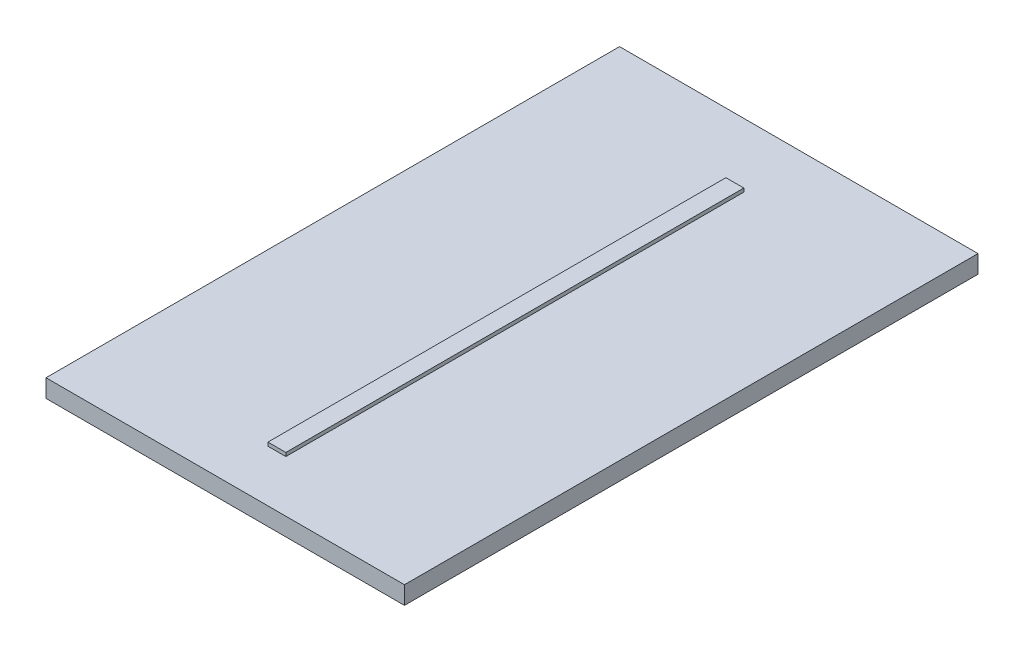
ISO-10303-21;
HEADER;
FILE_DESCRIPTION(('STEP AP214'),'2;1');
FILE_NAME('part.step','',(''),(''),'','','');
FILE_SCHEMA(('AUTOMOTIVE_DESIGN { 1 0 10303 214 1 1 1 1 }'));
ENDSEC;
DATA;
#1=APPLICATION_CONTEXT('core data for automotive mechanical design processes');
#2=APPLICATION_PROTOCOL_DEFINITION('international standard','automotive_design',2000,#1);
#3=PRODUCT_CONTEXT('',#1,'mechanical');
#4=PRODUCT('Part','Part','',(#3));
#5=PRODUCT_RELATED_PRODUCT_CATEGORY('part','',(#4));
#6=PRODUCT_DEFINITION_FORMATION('','',#4);
#7=PRODUCT_DEFINITION_CONTEXT('part definition',#1,'design');
#8=PRODUCT_DEFINITION('design','',#6,#7);
#9=PRODUCT_DEFINITION_SHAPE('','',#8);
#10=(LENGTH_UNIT() NAMED_UNIT(*) SI_UNIT(.MILLI.,.METRE.));
#11=(NAMED_UNIT(*) PLANE_ANGLE_UNIT() SI_UNIT($,.RADIAN.));
#12=(NAMED_UNIT(*) SI_UNIT($,.STERADIAN.) SOLID_ANGLE_UNIT());
#13=UNCERTAINTY_MEASURE_WITH_UNIT(LENGTH_MEASURE(1.E-05),#10,'distance_accuracy_value','');
#14=(GEOMETRIC_REPRESENTATION_CONTEXT(3) GLOBAL_UNCERTAINTY_ASSIGNED_CONTEXT((#13)) GLOBAL_UNIT_ASSIGNED_CONTEXT((#10,
#11,#12)) REPRESENTATION_CONTEXT('',''));
#15=CARTESIAN_POINT('',(0.,0.,0.));
#16=DIRECTION('',(0.,0.,1.));
#17=DIRECTION('',(1.,0.,0.));
#18=AXIS2_PLACEMENT_3D('',#15,#16,#17);
#19=CARTESIAN_POINT('',(0.,0.5,0.));
#20=DIRECTION('',(0.,1.,0.));
#21=DIRECTION('',(0.,0.,1.));
#22=AXIS2_PLACEMENT_3D('',#19,#20,#21);
#23=PLANE('',#22);
#24=DIRECTION('',(0.,0.,-1.));
#25=VECTOR('',#24,1.);
#26=CARTESIAN_POINT('',(5.,0.5,-8.));
#27=LINE('',#26,#25);
#28=CARTESIAN_POINT('',(5.,0.5,8.));
#29=VERTEX_POINT('',#28);
#30=CARTESIAN_POINT('',(5.,0.5,-8.));
#31=VERTEX_POINT('',#30);
#32=EDGE_CURVE('E142',#29,#31,#27,.T.);
#33=ORIENTED_EDGE('',*,*,#32,.T.);
#34=DIRECTION('',(-1.,0.,0.));
#35=VECTOR('',#34,1.);
#36=CARTESIAN_POINT('',(-5.,0.5,-8.));
#37=LINE('',#36,#35);
#38=CARTESIAN_POINT('',(-5.,0.5,-8.));
#39=VERTEX_POINT('',#38);
#40=EDGE_CURVE('E87',#31,#39,#37,.T.);
#41=ORIENTED_EDGE('',*,*,#40,.T.);
#42=DIRECTION('',(0.,0.,1.));
#43=VECTOR('',#42,1.);
#44=CARTESIAN_POINT('',(-5.,0.5,-8.));
#45=LINE('',#44,#43);
#46=CARTESIAN_POINT('',(-5.,0.5,8.));
#47=VERTEX_POINT('',#46);
#48=EDGE_CURVE('E145',#39,#47,#45,.T.);
#49=ORIENTED_EDGE('',*,*,#48,.T.);
#50=DIRECTION('',(1.,0.,0.));
#51=VECTOR('',#50,1.);
#52=CARTESIAN_POINT('',(-5.,0.5,8.));
#53=LINE('',#52,#51);
#54=EDGE_CURVE('E59',#47,#29,#53,.T.);
#55=ORIENTED_EDGE('',*,*,#54,.T.);
#56=EDGE_LOOP('',(#33,#41,#49,#55));
#57=FACE_BOUND('',#56,.T.);
#58=DIRECTION('',(-1.,0.,0.));
#59=VECTOR('',#58,1.);
#60=CARTESIAN_POINT('',(-0.250000000000001,0.5,-6.21728312292191));
#61=LINE('',#60,#59);
#62=CARTESIAN_POINT('',(0.249999999999999,0.5,-6.21728312292191));
#63=VERTEX_POINT('',#62);
#64=CARTESIAN_POINT('',(-0.250000000000001,0.5,-6.21728312292191));
#65=VERTEX_POINT('',#64);
#66=EDGE_CURVE('E265',#63,#65,#61,.T.);
#67=ORIENTED_EDGE('',*,*,#66,.F.);
#68=DIRECTION('',(0.,0.,-1.));
#69=VECTOR('',#68,1.);
#70=CARTESIAN_POINT('',(0.249999999999999,0.5,-6.21728312292191));
#71=LINE('',#70,#69);
#72=CARTESIAN_POINT('',(0.250000000000001,0.5,6.55913442902545));
#73=VERTEX_POINT('',#72);
#74=EDGE_CURVE('E132',#73,#63,#71,.T.);
#75=ORIENTED_EDGE('',*,*,#74,.F.);
#76=DIRECTION('',(1.,0.,0.));
#77=VECTOR('',#76,1.);
#78=CARTESIAN_POINT('',(-0.249999999999999,0.5,6.55913442902545));
#79=LINE('',#78,#77);
#80=CARTESIAN_POINT('',(-0.249999999999999,0.5,6.55913442902545));
#81=VERTEX_POINT('',#80);
#82=EDGE_CURVE('E128',#81,#73,#79,.T.);
#83=ORIENTED_EDGE('',*,*,#82,.F.);
#84=DIRECTION('',(0.,0.,1.));
#85=VECTOR('',#84,1.);
#86=CARTESIAN_POINT('',(-0.250000000000001,0.5,-6.21728312292191));
#87=LINE('',#86,#85);
#88=EDGE_CURVE('E262',#65,#81,#87,.T.);
#89=ORIENTED_EDGE('',*,*,#88,.F.);
#90=EDGE_LOOP('',(#67,#75,#83,#89));
#91=FACE_BOUND('',#90,.T.);
#92=ADVANCED_FACE('F35',(#57,#91),#23,.T.);
#93=CARTESIAN_POINT('',(5.,0.5,-8.));
#94=DIRECTION('',(-1.,0.,0.));
#95=DIRECTION('',(0.,0.,1.));
#96=AXIS2_PLACEMENT_3D('',#93,#94,#95);
#97=PLANE('',#96);
#98=DIRECTION('',(0.,0.,-1.));
#99=VECTOR('',#98,1.);
#100=CARTESIAN_POINT('',(5.,0.,-8.));
#101=LINE('',#100,#99);
#102=CARTESIAN_POINT('',(5.,0.,8.));
#103=VERTEX_POINT('',#102);
#104=CARTESIAN_POINT('',(5.,0.,-8.));
#105=VERTEX_POINT('',#104);
#106=EDGE_CURVE('E134',#103,#105,#101,.T.);
#107=ORIENTED_EDGE('',*,*,#106,.T.);
#108=DIRECTION('',(0.,-1.,0.));
#109=VECTOR('',#108,1.);
#110=CARTESIAN_POINT('',(5.,0.5,-8.));
#111=LINE('',#110,#109);
#112=EDGE_CURVE('E11',#31,#105,#111,.T.);
#113=ORIENTED_EDGE('',*,*,#112,.F.);
#114=ORIENTED_EDGE('',*,*,#32,.F.);
#115=DIRECTION('',(0.,-1.,0.));
#116=VECTOR('',#115,1.);
#117=CARTESIAN_POINT('',(5.,0.5,8.));
#118=LINE('',#117,#116);
#119=EDGE_CURVE('E147',#29,#103,#118,.T.);
#120=ORIENTED_EDGE('',*,*,#119,.T.);
#121=EDGE_LOOP('',(#107,#113,#114,#120));
#122=FACE_BOUND('',#121,.T.);
#123=ADVANCED_FACE('F37',(#122),#97,.F.);
#124=CARTESIAN_POINT('',(-5.,0.5,-8.));
#125=DIRECTION('',(0.,0.,1.));
#126=DIRECTION('',(1.,0.,0.));
#127=AXIS2_PLACEMENT_3D('',#124,#125,#126);
#128=PLANE('',#127);
#129=DIRECTION('',(-1.,0.,0.));
#130=VECTOR('',#129,1.);
#131=CARTESIAN_POINT('',(-5.,0.,-8.));
#132=LINE('',#131,#130);
#133=CARTESIAN_POINT('',(-5.,0.,-8.));
#134=VERTEX_POINT('',#133);
#135=EDGE_CURVE('E137',#105,#134,#132,.T.);
#136=ORIENTED_EDGE('',*,*,#135,.T.);
#137=DIRECTION('',(0.,-1.,0.));
#138=VECTOR('',#137,1.);
#139=CARTESIAN_POINT('',(-5.,0.5,-8.));
#140=LINE('',#139,#138);
#141=EDGE_CURVE('E43',#39,#134,#140,.T.);
#142=ORIENTED_EDGE('',*,*,#141,.F.);
#143=ORIENTED_EDGE('',*,*,#40,.F.);
#144=ORIENTED_EDGE('',*,*,#112,.T.);
#145=EDGE_LOOP('',(#136,#142,#143,#144));
#146=FACE_BOUND('',#145,.T.);
#147=ADVANCED_FACE('F175',(#146),#128,.F.);
#148=CARTESIAN_POINT('',(-5.,0.5,-8.));
#149=DIRECTION('',(1.,0.,0.));
#150=DIRECTION('',(0.,0.,-1.));
#151=AXIS2_PLACEMENT_3D('',#148,#149,#150);
#152=PLANE('',#151);
#153=DIRECTION('',(0.,0.,1.));
#154=VECTOR('',#153,1.);
#155=CARTESIAN_POINT('',(-5.,0.,-8.));
#156=LINE('',#155,#154);
#157=CARTESIAN_POINT('',(-5.,0.,8.));
#158=VERTEX_POINT('',#157);
#159=EDGE_CURVE('E150',#134,#158,#156,.T.);
#160=ORIENTED_EDGE('',*,*,#159,.T.);
#161=DIRECTION('',(0.,-1.,0.));
#162=VECTOR('',#161,1.);
#163=CARTESIAN_POINT('',(-5.,0.5,8.));
#164=LINE('',#163,#162);
#165=EDGE_CURVE('E154',#47,#158,#164,.T.);
#166=ORIENTED_EDGE('',*,*,#165,.F.);
#167=ORIENTED_EDGE('',*,*,#48,.F.);
#168=ORIENTED_EDGE('',*,*,#141,.T.);
#169=EDGE_LOOP('',(#160,#166,#167,#168));
#170=FACE_BOUND('',#169,.T.);
#171=ADVANCED_FACE('F159',(#170),#152,.F.);
#172=CARTESIAN_POINT('',(-5.,0.5,8.));
#173=DIRECTION('',(0.,0.,-1.));
#174=DIRECTION('',(-1.,0.,0.));
#175=AXIS2_PLACEMENT_3D('',#172,#173,#174);
#176=PLANE('',#175);
#177=DIRECTION('',(1.,0.,0.));
#178=VECTOR('',#177,1.);
#179=CARTESIAN_POINT('',(-5.,0.,8.));
#180=LINE('',#179,#178);
#181=EDGE_CURVE('E80',#158,#103,#180,.T.);
#182=ORIENTED_EDGE('',*,*,#181,.T.);
#183=ORIENTED_EDGE('',*,*,#119,.F.);
#184=ORIENTED_EDGE('',*,*,#54,.F.);
#185=ORIENTED_EDGE('',*,*,#165,.T.);
#186=EDGE_LOOP('',(#182,#183,#184,#185));
#187=FACE_BOUND('',#186,.T.);
#188=ADVANCED_FACE('F167',(#187),#176,.F.);
#189=CARTESIAN_POINT('',(0.,0.,0.));
#190=DIRECTION('',(0.,1.,0.));
#191=DIRECTION('',(0.,0.,1.));
#192=AXIS2_PLACEMENT_3D('',#189,#190,#191);
#193=PLANE('',#192);
#194=ORIENTED_EDGE('',*,*,#106,.F.);
#195=ORIENTED_EDGE('',*,*,#181,.F.);
#196=ORIENTED_EDGE('',*,*,#159,.F.);
#197=ORIENTED_EDGE('',*,*,#135,.F.);
#198=EDGE_LOOP('',(#194,#195,#196,#197));
#199=FACE_BOUND('',#198,.T.);
#200=ADVANCED_FACE('F163',(#199),#193,.F.);
#201=CARTESIAN_POINT('',(0.249999999999999,0.6,-6.21728312292191));
#202=DIRECTION('',(-1.,0.,0.));
#203=DIRECTION('',(0.,0.,1.));
#204=AXIS2_PLACEMENT_3D('',#201,#202,#203);
#205=PLANE('',#204);
#206=ORIENTED_EDGE('',*,*,#74,.T.);
#207=DIRECTION('',(0.,-1.,0.));
#208=VECTOR('',#207,1.);
#209=CARTESIAN_POINT('',(0.249999999999999,0.6,-6.21728312292191));
#210=LINE('',#209,#208);
#211=CARTESIAN_POINT('',(0.249999999999999,0.6,-6.21728312292191));
#212=VERTEX_POINT('',#211);
#213=EDGE_CURVE('E113',#212,#63,#210,.T.);
#214=ORIENTED_EDGE('',*,*,#213,.F.);
#215=DIRECTION('',(0.,0.,-1.));
#216=VECTOR('',#215,1.);
#217=CARTESIAN_POINT('',(0.249999999999999,0.6,-6.21728312292191));
#218=LINE('',#217,#216);
#219=CARTESIAN_POINT('',(0.250000000000001,0.6,6.55913442902545));
#220=VERTEX_POINT('',#219);
#221=EDGE_CURVE('E120',#220,#212,#218,.T.);
#222=ORIENTED_EDGE('',*,*,#221,.F.);
#223=DIRECTION('',(0.,-1.,0.));
#224=VECTOR('',#223,1.);
#225=CARTESIAN_POINT('',(0.250000000000001,0.6,6.55913442902545));
#226=LINE('',#225,#224);
#227=EDGE_CURVE('E260',#220,#73,#226,.T.);
#228=ORIENTED_EDGE('',*,*,#227,.T.);
#229=EDGE_LOOP('',(#206,#214,#222,#228));
#230=FACE_BOUND('',#229,.T.);
#231=ADVANCED_FACE('F130',(#230),#205,.F.);
#232=CARTESIAN_POINT('',(-0.250000000000001,0.6,-6.21728312292191));
#233=DIRECTION('',(0.,0.,1.));
#234=DIRECTION('',(1.,0.,0.));
#235=AXIS2_PLACEMENT_3D('',#232,#233,#234);
#236=PLANE('',#235);
#237=ORIENTED_EDGE('',*,*,#66,.T.);
#238=DIRECTION('',(0.,-1.,0.));
#239=VECTOR('',#238,1.);
#240=CARTESIAN_POINT('',(-0.250000000000001,0.6,-6.21728312292191));
#241=LINE('',#240,#239);
#242=CARTESIAN_POINT('',(-0.250000000000001,0.6,-6.21728312292191));
#243=VERTEX_POINT('',#242);
#244=EDGE_CURVE('E116',#243,#65,#241,.T.);
#245=ORIENTED_EDGE('',*,*,#244,.F.);
#246=DIRECTION('',(-1.,0.,0.));
#247=VECTOR('',#246,1.);
#248=CARTESIAN_POINT('',(-0.250000000000001,0.6,-6.21728312292191));
#249=LINE('',#248,#247);
#250=EDGE_CURVE('E109',#212,#243,#249,.T.);
#251=ORIENTED_EDGE('',*,*,#250,.F.);
#252=ORIENTED_EDGE('',*,*,#213,.T.);
#253=EDGE_LOOP('',(#237,#245,#251,#252));
#254=FACE_BOUND('',#253,.T.);
#255=ADVANCED_FACE('F111',(#254),#236,.F.);
#256=CARTESIAN_POINT('',(-0.250000000000001,0.6,-6.21728312292191));
#257=DIRECTION('',(1.,0.,0.));
#258=DIRECTION('',(0.,0.,-1.));
#259=AXIS2_PLACEMENT_3D('',#256,#257,#258);
#260=PLANE('',#259);
#261=ORIENTED_EDGE('',*,*,#88,.T.);
#262=DIRECTION('',(0.,-1.,0.));
#263=VECTOR('',#262,1.);
#264=CARTESIAN_POINT('',(-0.249999999999999,0.6,6.55913442902545));
#265=LINE('',#264,#263);
#266=CARTESIAN_POINT('',(-0.249999999999999,0.6,6.55913442902545));
#267=VERTEX_POINT('',#266);
#268=EDGE_CURVE('E50',#267,#81,#265,.T.);
#269=ORIENTED_EDGE('',*,*,#268,.F.);
#270=DIRECTION('',(0.,0.,1.));
#271=VECTOR('',#270,1.);
#272=CARTESIAN_POINT('',(-0.250000000000001,0.6,-6.21728312292191));
#273=LINE('',#272,#271);
#274=EDGE_CURVE('E119',#243,#267,#273,.T.);
#275=ORIENTED_EDGE('',*,*,#274,.F.);
#276=ORIENTED_EDGE('',*,*,#244,.T.);
#277=EDGE_LOOP('',(#261,#269,#275,#276));
#278=FACE_BOUND('',#277,.T.);
#279=ADVANCED_FACE('F188',(#278),#260,.F.);
#280=CARTESIAN_POINT('',(-0.249999999999999,0.6,6.55913442902545));
#281=DIRECTION('',(0.,0.,-1.));
#282=DIRECTION('',(-1.,0.,0.));
#283=AXIS2_PLACEMENT_3D('',#280,#281,#282);
#284=PLANE('',#283);
#285=ORIENTED_EDGE('',*,*,#82,.T.);
#286=ORIENTED_EDGE('',*,*,#227,.F.);
#287=DIRECTION('',(1.,0.,0.));
#288=VECTOR('',#287,1.);
#289=CARTESIAN_POINT('',(-0.249999999999999,0.6,6.55913442902545));
#290=LINE('',#289,#288);
#291=EDGE_CURVE('E124',#267,#220,#290,.T.);
#292=ORIENTED_EDGE('',*,*,#291,.F.);
#293=ORIENTED_EDGE('',*,*,#268,.T.);
#294=EDGE_LOOP('',(#285,#286,#292,#293));
#295=FACE_BOUND('',#294,.T.);
#296=ADVANCED_FACE('F191',(#295),#284,.F.);
#297=CARTESIAN_POINT('',(0.,0.6,0.));
#298=DIRECTION('',(0.,1.,0.));
#299=DIRECTION('',(0.,0.,1.));
#300=AXIS2_PLACEMENT_3D('',#297,#298,#299);
#301=PLANE('',#300);
#302=ORIENTED_EDGE('',*,*,#221,.T.);
#303=ORIENTED_EDGE('',*,*,#250,.T.);
#304=ORIENTED_EDGE('',*,*,#274,.T.);
#305=ORIENTED_EDGE('',*,*,#291,.T.);
#306=EDGE_LOOP('',(#302,#303,#304,#305));
#307=FACE_BOUND('',#306,.T.);
#308=ADVANCED_FACE('F123',(#307),#301,.T.);
#309=CLOSED_SHELL('',(#92,#123,#147,#171,#188,#200,#231,#255,#279,#296,#308));
#310=MANIFOLD_SOLID_BREP('B2',#309);
#311=ADVANCED_BREP_SHAPE_REPRESENTATION('',(#18,#310),#14);
#312=SHAPE_DEFINITION_REPRESENTATION(#9,#311);
ENDSEC;
END-ISO-10303-21;
